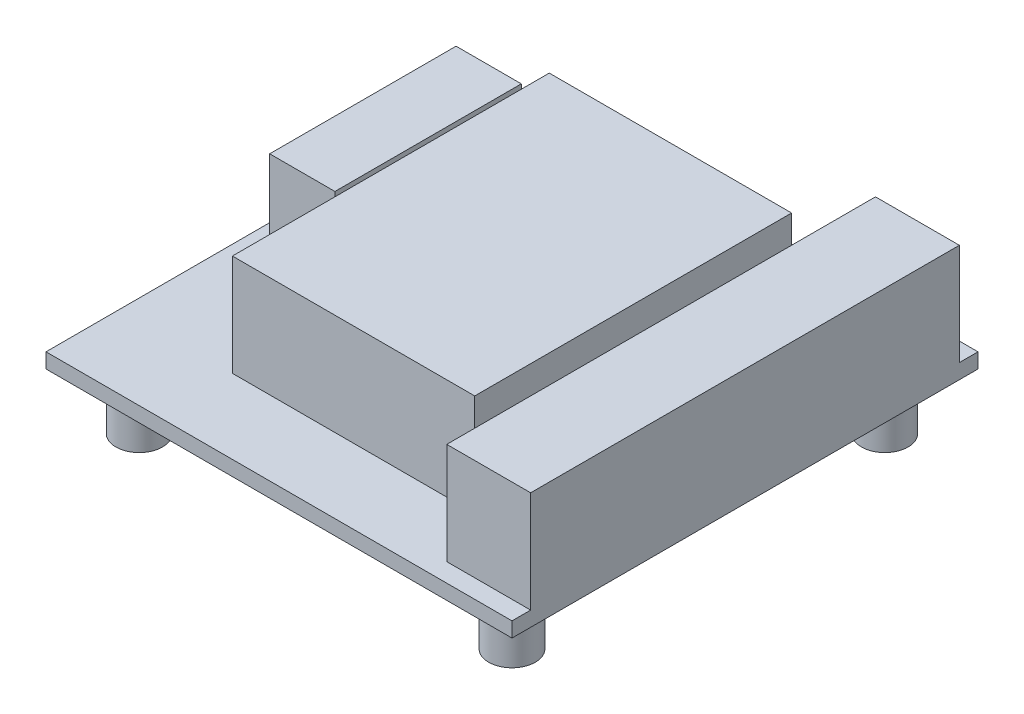
ISO-10303-21;
HEADER;
FILE_DESCRIPTION(('STEP AP214'),'2;1');
FILE_NAME('part.step','',(''),(''),'','','');
FILE_SCHEMA(('AUTOMOTIVE_DESIGN { 1 0 10303 214 1 1 1 1 }'));
ENDSEC;
DATA;
#1=APPLICATION_CONTEXT('core data for automotive mechanical design processes');
#2=APPLICATION_PROTOCOL_DEFINITION('international standard','automotive_design',2000,#1);
#3=PRODUCT_CONTEXT('',#1,'mechanical');
#4=PRODUCT('Part','Part','',(#3));
#5=PRODUCT_RELATED_PRODUCT_CATEGORY('part','',(#4));
#6=PRODUCT_DEFINITION_FORMATION('','',#4);
#7=PRODUCT_DEFINITION_CONTEXT('part definition',#1,'design');
#8=PRODUCT_DEFINITION('design','',#6,#7);
#9=PRODUCT_DEFINITION_SHAPE('','',#8);
#10=(LENGTH_UNIT() NAMED_UNIT(*) SI_UNIT(.MILLI.,.METRE.));
#11=(NAMED_UNIT(*) PLANE_ANGLE_UNIT() SI_UNIT($,.RADIAN.));
#12=(NAMED_UNIT(*) SI_UNIT($,.STERADIAN.) SOLID_ANGLE_UNIT());
#13=UNCERTAINTY_MEASURE_WITH_UNIT(LENGTH_MEASURE(1.E-05),#10,'distance_accuracy_value','');
#14=(GEOMETRIC_REPRESENTATION_CONTEXT(3) GLOBAL_UNCERTAINTY_ASSIGNED_CONTEXT((#13)) GLOBAL_UNIT_ASSIGNED_CONTEXT((#10,
#11,#12)) REPRESENTATION_CONTEXT('',''));
#15=CARTESIAN_POINT('',(0.,0.,0.));
#16=DIRECTION('',(0.,0.,1.));
#17=DIRECTION('',(1.,0.,0.));
#18=AXIS2_PLACEMENT_3D('',#15,#16,#17);
#19=CARTESIAN_POINT('',(0.,7.6,0.));
#20=DIRECTION('',(0.,1.,0.));
#21=DIRECTION('',(0.,0.,1.));
#22=AXIS2_PLACEMENT_3D('',#19,#20,#21);
#23=PLANE('',#22);
#24=DIRECTION('',(-1.,0.,0.));
#25=VECTOR('',#24,1.);
#26=CARTESIAN_POINT('',(25.,7.6,-23.));
#27=LINE('',#26,#25);
#28=CARTESIAN_POINT('',(25.,7.6,-23.));
#29=VERTEX_POINT('',#28);
#30=CARTESIAN_POINT('',(16.,7.6,-23.));
#31=VERTEX_POINT('',#30);
#32=EDGE_CURVE('E193',#29,#31,#27,.T.);
#33=ORIENTED_EDGE('',*,*,#32,.F.);
#34=DIRECTION('',(0.,0.,-1.));
#35=VECTOR('',#34,1.);
#36=CARTESIAN_POINT('',(25.,7.6,25.));
#37=LINE('',#36,#35);
#38=CARTESIAN_POINT('',(25.,7.6,-25.));
#39=VERTEX_POINT('',#38);
#40=EDGE_CURVE('E259',#29,#39,#37,.T.);
#41=ORIENTED_EDGE('',*,*,#40,.T.);
#42=DIRECTION('',(-1.,0.,0.));
#43=VECTOR('',#42,1.);
#44=CARTESIAN_POINT('',(25.,7.6,-25.));
#45=LINE('',#44,#43);
#46=CARTESIAN_POINT('',(-25.,7.6,-25.));
#47=VERTEX_POINT('',#46);
#48=EDGE_CURVE('E263',#39,#47,#45,.T.);
#49=ORIENTED_EDGE('',*,*,#48,.T.);
#50=DIRECTION('',(0.,0.,1.));
#51=VECTOR('',#50,1.);
#52=CARTESIAN_POINT('',(-25.,7.6,-25.));
#53=LINE('',#52,#51);
#54=CARTESIAN_POINT('',(-25.,7.6,25.));
#55=VERTEX_POINT('',#54);
#56=EDGE_CURVE('E251',#47,#55,#53,.T.);
#57=ORIENTED_EDGE('',*,*,#56,.T.);
#58=DIRECTION('',(1.,0.,0.));
#59=VECTOR('',#58,1.);
#60=CARTESIAN_POINT('',(-25.,7.6,25.));
#61=LINE('',#60,#59);
#62=CARTESIAN_POINT('',(25.,7.6,25.));
#63=VERTEX_POINT('',#62);
#64=EDGE_CURVE('E258',#55,#63,#61,.T.);
#65=ORIENTED_EDGE('',*,*,#64,.T.);
#66=CARTESIAN_POINT('',(25.,7.6,23.));
#67=VERTEX_POINT('',#66);
#68=EDGE_CURVE('E257',#63,#67,#37,.T.);
#69=ORIENTED_EDGE('',*,*,#68,.T.);
#70=DIRECTION('',(1.,0.,0.));
#71=VECTOR('',#70,1.);
#72=CARTESIAN_POINT('',(16.,7.6,23.));
#73=LINE('',#72,#71);
#74=CARTESIAN_POINT('',(16.,7.6,23.));
#75=VERTEX_POINT('',#74);
#76=EDGE_CURVE('E183',#75,#67,#73,.T.);
#77=ORIENTED_EDGE('',*,*,#76,.F.);
#78=DIRECTION('',(0.,0.,1.));
#79=VECTOR('',#78,1.);
#80=CARTESIAN_POINT('',(16.,7.6,-23.));
#81=LINE('',#80,#79);
#82=EDGE_CURVE('E181',#31,#75,#81,.T.);
#83=ORIENTED_EDGE('',*,*,#82,.F.);
#84=EDGE_LOOP('',(#33,#41,#49,#57,#65,#69,#77,#83));
#85=FACE_BOUND('',#84,.T.);
#86=DIRECTION('',(0.,0.,1.));
#87=VECTOR('',#86,1.);
#88=CARTESIAN_POINT('',(-13.,7.6,-17.));
#89=LINE('',#88,#87);
#90=CARTESIAN_POINT('',(-13.,7.6,-17.));
#91=VERTEX_POINT('',#90);
#92=CARTESIAN_POINT('',(-13.,7.6,17.));
#93=VERTEX_POINT('',#92);
#94=EDGE_CURVE('E209',#91,#93,#89,.T.);
#95=ORIENTED_EDGE('',*,*,#94,.F.);
#96=DIRECTION('',(-1.,0.,0.));
#97=VECTOR('',#96,1.);
#98=CARTESIAN_POINT('',(13.,7.6,-17.));
#99=LINE('',#98,#97);
#100=CARTESIAN_POINT('',(13.,7.6,-17.));
#101=VERTEX_POINT('',#100);
#102=EDGE_CURVE('E214',#101,#91,#99,.T.);
#103=ORIENTED_EDGE('',*,*,#102,.F.);
#104=DIRECTION('',(0.,0.,-1.));
#105=VECTOR('',#104,1.);
#106=CARTESIAN_POINT('',(13.,7.6,17.));
#107=LINE('',#106,#105);
#108=CARTESIAN_POINT('',(13.,7.6,17.));
#109=VERTEX_POINT('',#108);
#110=EDGE_CURVE('E229',#109,#101,#107,.T.);
#111=ORIENTED_EDGE('',*,*,#110,.F.);
#112=DIRECTION('',(1.,0.,0.));
#113=VECTOR('',#112,1.);
#114=CARTESIAN_POINT('',(-13.,7.6,17.));
#115=LINE('',#114,#113);
#116=EDGE_CURVE('E221',#93,#109,#115,.T.);
#117=ORIENTED_EDGE('',*,*,#116,.F.);
#118=EDGE_LOOP('',(#95,#103,#111,#117));
#119=FACE_BOUND('',#118,.T.);
#120=DIRECTION('',(1.,0.,0.));
#121=VECTOR('',#120,1.);
#122=CARTESIAN_POINT('',(-23.,7.6,3.));
#123=LINE('',#122,#121);
#124=CARTESIAN_POINT('',(-23.,7.6,3.));
#125=VERTEX_POINT('',#124);
#126=CARTESIAN_POINT('',(-16.,7.6,3.));
#127=VERTEX_POINT('',#126);
#128=EDGE_CURVE('E712',#125,#127,#123,.T.);
#129=ORIENTED_EDGE('',*,*,#128,.F.);
#130=DIRECTION('',(0.,0.,1.));
#131=VECTOR('',#130,1.);
#132=CARTESIAN_POINT('',(-23.,7.6,-17.));
#133=LINE('',#132,#131);
#134=CARTESIAN_POINT('',(-23.,7.6,-17.));
#135=VERTEX_POINT('',#134);
#136=EDGE_CURVE('E182',#135,#125,#133,.T.);
#137=ORIENTED_EDGE('',*,*,#136,.F.);
#138=DIRECTION('',(-1.,0.,0.));
#139=VECTOR('',#138,1.);
#140=CARTESIAN_POINT('',(-16.,7.6,-17.));
#141=LINE('',#140,#139);
#142=CARTESIAN_POINT('',(-16.,7.6,-17.));
#143=VERTEX_POINT('',#142);
#144=EDGE_CURVE('E180',#143,#135,#141,.T.);
#145=ORIENTED_EDGE('',*,*,#144,.F.);
#146=DIRECTION('',(0.,0.,-1.));
#147=VECTOR('',#146,1.);
#148=CARTESIAN_POINT('',(-16.,7.6,3.));
#149=LINE('',#148,#147);
#150=EDGE_CURVE('E709',#127,#143,#149,.T.);
#151=ORIENTED_EDGE('',*,*,#150,.F.);
#152=EDGE_LOOP('',(#129,#137,#145,#151));
#153=FACE_BOUND('',#152,.T.);
#154=ADVANCED_FACE('F43',(#85,#119,#153),#23,.T.);
#155=CARTESIAN_POINT('',(-20.,6.,-20.));
#156=DIRECTION('',(0.,-1.,0.));
#157=DIRECTION('',(0.,0.,-1.));
#158=AXIS2_PLACEMENT_3D('',#155,#156,#157);
#159=CYLINDRICAL_SURFACE('',#158,2.5);
#160=CARTESIAN_POINT('',(-20.,6.,-20.));
#161=DIRECTION('',(0.,1.,0.));
#162=DIRECTION('',(0.,0.,1.));
#163=AXIS2_PLACEMENT_3D('',#160,#161,#162);
#164=CIRCLE('',#163,2.5);
#165=CARTESIAN_POINT('',(-20.,6.,-17.5));
#166=VERTEX_POINT('',#165);
#167=EDGE_CURVE('E281',#166,#166,#164,.T.);
#168=ORIENTED_EDGE('',*,*,#167,.F.);
#169=EDGE_LOOP('',(#168));
#170=FACE_BOUND('',#169,.T.);
#171=CARTESIAN_POINT('',(-20.,0.,-20.));
#172=DIRECTION('',(0.,1.,0.));
#173=DIRECTION('',(0.,0.,1.));
#174=AXIS2_PLACEMENT_3D('',#171,#172,#173);
#175=CIRCLE('',#174,2.5);
#176=CARTESIAN_POINT('',(-20.,0.,-17.5));
#177=VERTEX_POINT('',#176);
#178=EDGE_CURVE('E285',#177,#177,#175,.T.);
#179=ORIENTED_EDGE('',*,*,#178,.T.);
#180=EDGE_LOOP('',(#179));
#181=FACE_BOUND('',#180,.T.);
#182=ADVANCED_FACE('F44',(#170,#181),#159,.T.);
#183=CARTESIAN_POINT('',(-20.,0.,-20.));
#184=DIRECTION('',(0.,1.,0.));
#185=DIRECTION('',(0.,0.,1.));
#186=AXIS2_PLACEMENT_3D('',#183,#184,#185);
#187=PLANE('',#186);
#188=ORIENTED_EDGE('',*,*,#178,.F.);
#189=EDGE_LOOP('',(#188));
#190=FACE_BOUND('',#189,.T.);
#191=ADVANCED_FACE('F359',(#190),#187,.F.);
#192=CARTESIAN_POINT('',(-25.,7.6,-25.));
#193=DIRECTION('',(1.,0.,0.));
#194=DIRECTION('',(0.,0.,-1.));
#195=AXIS2_PLACEMENT_3D('',#192,#193,#194);
#196=PLANE('',#195);
#197=DIRECTION('',(0.,0.,1.));
#198=VECTOR('',#197,1.);
#199=CARTESIAN_POINT('',(-25.,6.,-25.));
#200=LINE('',#199,#198);
#201=CARTESIAN_POINT('',(-25.,6.,-25.));
#202=VERTEX_POINT('',#201);
#203=CARTESIAN_POINT('',(-25.,6.,25.));
#204=VERTEX_POINT('',#203);
#205=EDGE_CURVE('E252',#202,#204,#200,.T.);
#206=ORIENTED_EDGE('',*,*,#205,.T.);
#207=DIRECTION('',(0.,-1.,0.));
#208=VECTOR('',#207,1.);
#209=CARTESIAN_POINT('',(-25.,7.6,25.));
#210=LINE('',#209,#208);
#211=EDGE_CURVE('E283',#55,#204,#210,.T.);
#212=ORIENTED_EDGE('',*,*,#211,.F.);
#213=ORIENTED_EDGE('',*,*,#56,.F.);
#214=DIRECTION('',(0.,-1.,0.));
#215=VECTOR('',#214,1.);
#216=CARTESIAN_POINT('',(-25.,7.6,-25.));
#217=LINE('',#216,#215);
#218=EDGE_CURVE('E264',#47,#202,#217,.T.);
#219=ORIENTED_EDGE('',*,*,#218,.T.);
#220=EDGE_LOOP('',(#206,#212,#213,#219));
#221=FACE_BOUND('',#220,.T.);
#222=ADVANCED_FACE('F314',(#221),#196,.F.);
#223=CARTESIAN_POINT('',(-25.,7.6,25.));
#224=DIRECTION('',(0.,0.,-1.));
#225=DIRECTION('',(-1.,0.,0.));
#226=AXIS2_PLACEMENT_3D('',#223,#224,#225);
#227=PLANE('',#226);
#228=DIRECTION('',(1.,0.,0.));
#229=VECTOR('',#228,1.);
#230=CARTESIAN_POINT('',(-25.,6.,25.));
#231=LINE('',#230,#229);
#232=CARTESIAN_POINT('',(25.,6.,25.));
#233=VERTEX_POINT('',#232);
#234=EDGE_CURVE('E268',#204,#233,#231,.T.);
#235=ORIENTED_EDGE('',*,*,#234,.T.);
#236=DIRECTION('',(0.,-1.,0.));
#237=VECTOR('',#236,1.);
#238=CARTESIAN_POINT('',(25.,7.6,25.));
#239=LINE('',#238,#237);
#240=EDGE_CURVE('E279',#63,#233,#239,.T.);
#241=ORIENTED_EDGE('',*,*,#240,.F.);
#242=ORIENTED_EDGE('',*,*,#64,.F.);
#243=ORIENTED_EDGE('',*,*,#211,.T.);
#244=EDGE_LOOP('',(#235,#241,#242,#243));
#245=FACE_BOUND('',#244,.T.);
#246=ADVANCED_FACE('F330',(#245),#227,.F.);
#247=CARTESIAN_POINT('',(25.,7.6,25.));
#248=DIRECTION('',(-1.,0.,0.));
#249=DIRECTION('',(0.,0.,1.));
#250=AXIS2_PLACEMENT_3D('',#247,#248,#249);
#251=PLANE('',#250);
#252=DIRECTION('',(0.,0.,-1.));
#253=VECTOR('',#252,1.);
#254=CARTESIAN_POINT('',(25.,6.,25.));
#255=LINE('',#254,#253);
#256=CARTESIAN_POINT('',(25.,6.,-25.));
#257=VERTEX_POINT('',#256);
#258=EDGE_CURVE('E269',#233,#257,#255,.T.);
#259=ORIENTED_EDGE('',*,*,#258,.T.);
#260=DIRECTION('',(0.,-1.,0.));
#261=VECTOR('',#260,1.);
#262=CARTESIAN_POINT('',(25.,7.6,-25.));
#263=LINE('',#262,#261);
#264=EDGE_CURVE('E274',#39,#257,#263,.T.);
#265=ORIENTED_EDGE('',*,*,#264,.F.);
#266=ORIENTED_EDGE('',*,*,#40,.F.);
#267=DIRECTION('',(0.,-1.,0.));
#268=VECTOR('',#267,1.);
#269=CARTESIAN_POINT('',(25.,18.5,-23.));
#270=LINE('',#269,#268);
#271=CARTESIAN_POINT('',(25.,18.5,-23.));
#272=VERTEX_POINT('',#271);
#273=EDGE_CURVE('E201',#272,#29,#270,.T.);
#274=ORIENTED_EDGE('',*,*,#273,.F.);
#275=DIRECTION('',(0.,0.,-1.));
#276=VECTOR('',#275,1.);
#277=CARTESIAN_POINT('',(25.,18.5,23.));
#278=LINE('',#277,#276);
#279=CARTESIAN_POINT('',(25.,18.5,23.));
#280=VERTEX_POINT('',#279);
#281=EDGE_CURVE('E198',#280,#272,#278,.T.);
#282=ORIENTED_EDGE('',*,*,#281,.F.);
#283=DIRECTION('',(0.,-1.,0.));
#284=VECTOR('',#283,1.);
#285=CARTESIAN_POINT('',(25.,18.5,23.));
#286=LINE('',#285,#284);
#287=EDGE_CURVE('E202',#280,#67,#286,.T.);
#288=ORIENTED_EDGE('',*,*,#287,.T.);
#289=ORIENTED_EDGE('',*,*,#68,.F.);
#290=ORIENTED_EDGE('',*,*,#240,.T.);
#291=EDGE_LOOP('',(#259,#265,#266,#274,#282,#288,#289,#290));
#292=FACE_BOUND('',#291,.T.);
#293=ADVANCED_FACE('F325',(#292),#251,.F.);
#294=CARTESIAN_POINT('',(25.,7.6,-25.));
#295=DIRECTION('',(0.,0.,1.));
#296=DIRECTION('',(1.,0.,0.));
#297=AXIS2_PLACEMENT_3D('',#294,#295,#296);
#298=PLANE('',#297);
#299=DIRECTION('',(-1.,0.,0.));
#300=VECTOR('',#299,1.);
#301=CARTESIAN_POINT('',(25.,6.,-25.));
#302=LINE('',#301,#300);
#303=EDGE_CURVE('E260',#257,#202,#302,.T.);
#304=ORIENTED_EDGE('',*,*,#303,.T.);
#305=ORIENTED_EDGE('',*,*,#218,.F.);
#306=ORIENTED_EDGE('',*,*,#48,.F.);
#307=ORIENTED_EDGE('',*,*,#264,.T.);
#308=EDGE_LOOP('',(#304,#305,#306,#307));
#309=FACE_BOUND('',#308,.T.);
#310=ADVANCED_FACE('F305',(#309),#298,.F.);
#311=CARTESIAN_POINT('',(0.,6.,0.));
#312=DIRECTION('',(0.,1.,0.));
#313=DIRECTION('',(0.,0.,1.));
#314=AXIS2_PLACEMENT_3D('',#311,#312,#313);
#315=PLANE('',#314);
#316=CARTESIAN_POINT('',(20.,6.,20.));
#317=DIRECTION('',(0.,1.,0.));
#318=DIRECTION('',(0.,0.,1.));
#319=AXIS2_PLACEMENT_3D('',#316,#317,#318);
#320=CIRCLE('',#319,2.5);
#321=CARTESIAN_POINT('',(20.,6.,22.5));
#322=VERTEX_POINT('',#321);
#323=EDGE_CURVE('E11',#322,#322,#320,.F.);
#324=ORIENTED_EDGE('',*,*,#323,.F.);
#325=EDGE_LOOP('',(#324));
#326=FACE_BOUND('',#325,.T.);
#327=CARTESIAN_POINT('',(-20.,6.,20.));
#328=DIRECTION('',(0.,1.,0.));
#329=DIRECTION('',(0.,0.,1.));
#330=AXIS2_PLACEMENT_3D('',#327,#328,#329);
#331=CIRCLE('',#330,2.5);
#332=CARTESIAN_POINT('',(-20.,6.,22.5));
#333=VERTEX_POINT('',#332);
#334=EDGE_CURVE('E51',#333,#333,#331,.F.);
#335=ORIENTED_EDGE('',*,*,#334,.F.);
#336=EDGE_LOOP('',(#335));
#337=FACE_BOUND('',#336,.T.);
#338=CARTESIAN_POINT('',(20.,6.,-20.));
#339=DIRECTION('',(0.,1.,0.));
#340=DIRECTION('',(0.,0.,1.));
#341=AXIS2_PLACEMENT_3D('',#338,#339,#340);
#342=CIRCLE('',#341,2.5);
#343=CARTESIAN_POINT('',(20.,6.,-17.5));
#344=VERTEX_POINT('',#343);
#345=EDGE_CURVE('E287',#344,#344,#342,.F.);
#346=ORIENTED_EDGE('',*,*,#345,.F.);
#347=EDGE_LOOP('',(#346));
#348=FACE_BOUND('',#347,.T.);
#349=ORIENTED_EDGE('',*,*,#167,.T.);
#350=EDGE_LOOP('',(#349));
#351=FACE_BOUND('',#350,.T.);
#352=ORIENTED_EDGE('',*,*,#205,.F.);
#353=ORIENTED_EDGE('',*,*,#303,.F.);
#354=ORIENTED_EDGE('',*,*,#258,.F.);
#355=ORIENTED_EDGE('',*,*,#234,.F.);
#356=EDGE_LOOP('',(#352,#353,#354,#355));
#357=FACE_BOUND('',#356,.T.);
#358=ADVANCED_FACE('F297',(#326,#337,#348,#351,#357),#315,.F.);
#359=CARTESIAN_POINT('',(20.,6.,-20.));
#360=DIRECTION('',(0.,-1.,0.));
#361=DIRECTION('',(0.,0.,-1.));
#362=AXIS2_PLACEMENT_3D('',#359,#360,#361);
#363=CYLINDRICAL_SURFACE('',#362,2.5);
#364=ORIENTED_EDGE('',*,*,#345,.T.);
#365=EDGE_LOOP('',(#364));
#366=FACE_BOUND('',#365,.T.);
#367=CARTESIAN_POINT('',(20.,0.,-20.));
#368=DIRECTION('',(0.,1.,0.));
#369=DIRECTION('',(0.,0.,1.));
#370=AXIS2_PLACEMENT_3D('',#367,#368,#369);
#371=CIRCLE('',#370,2.5);
#372=CARTESIAN_POINT('',(20.,0.,-17.5));
#373=VERTEX_POINT('',#372);
#374=EDGE_CURVE('E248',#373,#373,#371,.T.);
#375=ORIENTED_EDGE('',*,*,#374,.T.);
#376=EDGE_LOOP('',(#375));
#377=FACE_BOUND('',#376,.T.);
#378=ADVANCED_FACE('F301',(#366,#377),#363,.T.);
#379=CARTESIAN_POINT('',(20.,0.,-20.));
#380=DIRECTION('',(0.,1.,0.));
#381=DIRECTION('',(0.,0.,1.));
#382=AXIS2_PLACEMENT_3D('',#379,#380,#381);
#383=PLANE('',#382);
#384=ORIENTED_EDGE('',*,*,#374,.F.);
#385=EDGE_LOOP('',(#384));
#386=FACE_BOUND('',#385,.T.);
#387=ADVANCED_FACE('F408',(#386),#383,.F.);
#388=CARTESIAN_POINT('',(-20.,6.,20.));
#389=DIRECTION('',(0.,-1.,0.));
#390=DIRECTION('',(0.,0.,-1.));
#391=AXIS2_PLACEMENT_3D('',#388,#389,#390);
#392=CYLINDRICAL_SURFACE('',#391,2.5);
#393=ORIENTED_EDGE('',*,*,#334,.T.);
#394=EDGE_LOOP('',(#393));
#395=FACE_BOUND('',#394,.T.);
#396=CARTESIAN_POINT('',(-20.,0.,20.));
#397=DIRECTION('',(0.,1.,0.));
#398=DIRECTION('',(0.,0.,1.));
#399=AXIS2_PLACEMENT_3D('',#396,#397,#398);
#400=CIRCLE('',#399,2.5);
#401=CARTESIAN_POINT('',(-20.,0.,22.5));
#402=VERTEX_POINT('',#401);
#403=EDGE_CURVE('E246',#402,#402,#400,.T.);
#404=ORIENTED_EDGE('',*,*,#403,.T.);
#405=EDGE_LOOP('',(#404));
#406=FACE_BOUND('',#405,.T.);
#407=ADVANCED_FACE('F293',(#395,#406),#392,.T.);
#408=CARTESIAN_POINT('',(-20.,0.,20.));
#409=DIRECTION('',(0.,1.,0.));
#410=DIRECTION('',(0.,0.,1.));
#411=AXIS2_PLACEMENT_3D('',#408,#409,#410);
#412=PLANE('',#411);
#413=ORIENTED_EDGE('',*,*,#403,.F.);
#414=EDGE_LOOP('',(#413));
#415=FACE_BOUND('',#414,.T.);
#416=ADVANCED_FACE('F420',(#415),#412,.F.);
#417=CARTESIAN_POINT('',(20.,6.,20.));
#418=DIRECTION('',(0.,-1.,0.));
#419=DIRECTION('',(0.,0.,-1.));
#420=AXIS2_PLACEMENT_3D('',#417,#418,#419);
#421=CYLINDRICAL_SURFACE('',#420,2.5);
#422=ORIENTED_EDGE('',*,*,#323,.T.);
#423=EDGE_LOOP('',(#422));
#424=FACE_BOUND('',#423,.T.);
#425=CARTESIAN_POINT('',(20.,0.,20.));
#426=DIRECTION('',(0.,1.,0.));
#427=DIRECTION('',(0.,0.,1.));
#428=AXIS2_PLACEMENT_3D('',#425,#426,#427);
#429=CIRCLE('',#428,2.5);
#430=CARTESIAN_POINT('',(20.,0.,22.5));
#431=VERTEX_POINT('',#430);
#432=EDGE_CURVE('E242',#431,#431,#429,.T.);
#433=ORIENTED_EDGE('',*,*,#432,.T.);
#434=EDGE_LOOP('',(#433));
#435=FACE_BOUND('',#434,.T.);
#436=ADVANCED_FACE('F426',(#424,#435),#421,.T.);
#437=CARTESIAN_POINT('',(20.,0.,20.));
#438=DIRECTION('',(0.,1.,0.));
#439=DIRECTION('',(0.,0.,1.));
#440=AXIS2_PLACEMENT_3D('',#437,#438,#439);
#441=PLANE('',#440);
#442=ORIENTED_EDGE('',*,*,#432,.F.);
#443=EDGE_LOOP('',(#442));
#444=FACE_BOUND('',#443,.T.);
#445=ADVANCED_FACE('F432',(#444),#441,.F.);
#446=CARTESIAN_POINT('',(-13.,18.5,-17.));
#447=DIRECTION('',(1.,0.,0.));
#448=DIRECTION('',(0.,0.,-1.));
#449=AXIS2_PLACEMENT_3D('',#446,#447,#448);
#450=PLANE('',#449);
#451=ORIENTED_EDGE('',*,*,#94,.T.);
#452=DIRECTION('',(0.,-1.,0.));
#453=VECTOR('',#452,1.);
#454=CARTESIAN_POINT('',(-13.,18.5,17.));
#455=LINE('',#454,#453);
#456=CARTESIAN_POINT('',(-13.,18.5,17.));
#457=VERTEX_POINT('',#456);
#458=EDGE_CURVE('E238',#457,#93,#455,.T.);
#459=ORIENTED_EDGE('',*,*,#458,.F.);
#460=DIRECTION('',(0.,0.,1.));
#461=VECTOR('',#460,1.);
#462=CARTESIAN_POINT('',(-13.,18.5,-17.));
#463=LINE('',#462,#461);
#464=CARTESIAN_POINT('',(-13.,18.5,-17.));
#465=VERTEX_POINT('',#464);
#466=EDGE_CURVE('E211',#465,#457,#463,.T.);
#467=ORIENTED_EDGE('',*,*,#466,.F.);
#468=DIRECTION('',(0.,-1.,0.));
#469=VECTOR('',#468,1.);
#470=CARTESIAN_POINT('',(-13.,18.5,-17.));
#471=LINE('',#470,#469);
#472=EDGE_CURVE('E222',#465,#91,#471,.T.);
#473=ORIENTED_EDGE('',*,*,#472,.T.);
#474=EDGE_LOOP('',(#451,#459,#467,#473));
#475=FACE_BOUND('',#474,.T.);
#476=ADVANCED_FACE('F445',(#475),#450,.F.);
#477=CARTESIAN_POINT('',(-13.,18.5,17.));
#478=DIRECTION('',(0.,0.,-1.));
#479=DIRECTION('',(-1.,0.,0.));
#480=AXIS2_PLACEMENT_3D('',#477,#478,#479);
#481=PLANE('',#480);
#482=ORIENTED_EDGE('',*,*,#116,.T.);
#483=DIRECTION('',(0.,-1.,0.));
#484=VECTOR('',#483,1.);
#485=CARTESIAN_POINT('',(13.,18.5,17.));
#486=LINE('',#485,#484);
#487=CARTESIAN_POINT('',(13.,18.5,17.));
#488=VERTEX_POINT('',#487);
#489=EDGE_CURVE('E240',#488,#109,#486,.T.);
#490=ORIENTED_EDGE('',*,*,#489,.F.);
#491=DIRECTION('',(1.,0.,0.));
#492=VECTOR('',#491,1.);
#493=CARTESIAN_POINT('',(-13.,18.5,17.));
#494=LINE('',#493,#492);
#495=EDGE_CURVE('E212',#457,#488,#494,.T.);
#496=ORIENTED_EDGE('',*,*,#495,.F.);
#497=ORIENTED_EDGE('',*,*,#458,.T.);
#498=EDGE_LOOP('',(#482,#490,#496,#497));
#499=FACE_BOUND('',#498,.T.);
#500=ADVANCED_FACE('F446',(#499),#481,.F.);
#501=CARTESIAN_POINT('',(13.,18.5,17.));
#502=DIRECTION('',(-1.,0.,0.));
#503=DIRECTION('',(0.,0.,1.));
#504=AXIS2_PLACEMENT_3D('',#501,#502,#503);
#505=PLANE('',#504);
#506=ORIENTED_EDGE('',*,*,#110,.T.);
#507=DIRECTION('',(0.,-1.,0.));
#508=VECTOR('',#507,1.);
#509=CARTESIAN_POINT('',(13.,18.5,-17.));
#510=LINE('',#509,#508);
#511=CARTESIAN_POINT('',(13.,18.5,-17.));
#512=VERTEX_POINT('',#511);
#513=EDGE_CURVE('E233',#512,#101,#510,.T.);
#514=ORIENTED_EDGE('',*,*,#513,.F.);
#515=DIRECTION('',(0.,0.,-1.));
#516=VECTOR('',#515,1.);
#517=CARTESIAN_POINT('',(13.,18.5,17.));
#518=LINE('',#517,#516);
#519=EDGE_CURVE('E220',#488,#512,#518,.T.);
#520=ORIENTED_EDGE('',*,*,#519,.F.);
#521=ORIENTED_EDGE('',*,*,#489,.T.);
#522=EDGE_LOOP('',(#506,#514,#520,#521));
#523=FACE_BOUND('',#522,.T.);
#524=ADVANCED_FACE('F456',(#523),#505,.F.);
#525=CARTESIAN_POINT('',(13.,18.5,-17.));
#526=DIRECTION('',(0.,0.,1.));
#527=DIRECTION('',(1.,0.,0.));
#528=AXIS2_PLACEMENT_3D('',#525,#526,#527);
#529=PLANE('',#528);
#530=ORIENTED_EDGE('',*,*,#102,.T.);
#531=ORIENTED_EDGE('',*,*,#472,.F.);
#532=DIRECTION('',(-1.,0.,0.));
#533=VECTOR('',#532,1.);
#534=CARTESIAN_POINT('',(13.,18.5,-17.));
#535=LINE('',#534,#533);
#536=EDGE_CURVE('E218',#512,#465,#535,.T.);
#537=ORIENTED_EDGE('',*,*,#536,.F.);
#538=ORIENTED_EDGE('',*,*,#513,.T.);
#539=EDGE_LOOP('',(#530,#531,#537,#538));
#540=FACE_BOUND('',#539,.T.);
#541=ADVANCED_FACE('F354',(#540),#529,.F.);
#542=CARTESIAN_POINT('',(0.,18.5,0.));
#543=DIRECTION('',(0.,1.,0.));
#544=DIRECTION('',(0.,0.,1.));
#545=AXIS2_PLACEMENT_3D('',#542,#543,#544);
#546=PLANE('',#545);
#547=ORIENTED_EDGE('',*,*,#466,.T.);
#548=ORIENTED_EDGE('',*,*,#495,.T.);
#549=ORIENTED_EDGE('',*,*,#519,.T.);
#550=ORIENTED_EDGE('',*,*,#536,.T.);
#551=EDGE_LOOP('',(#547,#548,#549,#550));
#552=FACE_BOUND('',#551,.T.);
#553=ADVANCED_FACE('F344',(#552),#546,.T.);
#554=CARTESIAN_POINT('',(16.,18.5,-23.));
#555=DIRECTION('',(1.,0.,0.));
#556=DIRECTION('',(0.,0.,-1.));
#557=AXIS2_PLACEMENT_3D('',#554,#555,#556);
#558=PLANE('',#557);
#559=ORIENTED_EDGE('',*,*,#82,.T.);
#560=DIRECTION('',(0.,-1.,0.));
#561=VECTOR('',#560,1.);
#562=CARTESIAN_POINT('',(16.,18.5,23.));
#563=LINE('',#562,#561);
#564=CARTESIAN_POINT('',(16.,18.5,23.));
#565=VERTEX_POINT('',#564);
#566=EDGE_CURVE('E208',#565,#75,#563,.T.);
#567=ORIENTED_EDGE('',*,*,#566,.F.);
#568=DIRECTION('',(0.,0.,1.));
#569=VECTOR('',#568,1.);
#570=CARTESIAN_POINT('',(16.,18.5,-23.));
#571=LINE('',#570,#569);
#572=CARTESIAN_POINT('',(16.,18.5,-23.));
#573=VERTEX_POINT('',#572);
#574=EDGE_CURVE('E186',#573,#565,#571,.T.);
#575=ORIENTED_EDGE('',*,*,#574,.F.);
#576=DIRECTION('',(0.,-1.,0.));
#577=VECTOR('',#576,1.);
#578=CARTESIAN_POINT('',(16.,18.5,-23.));
#579=LINE('',#578,#577);
#580=EDGE_CURVE('E66',#573,#31,#579,.T.);
#581=ORIENTED_EDGE('',*,*,#580,.T.);
#582=EDGE_LOOP('',(#559,#567,#575,#581));
#583=FACE_BOUND('',#582,.T.);
#584=ADVANCED_FACE('F342',(#583),#558,.F.);
#585=CARTESIAN_POINT('',(16.,18.5,23.));
#586=DIRECTION('',(0.,0.,-1.));
#587=DIRECTION('',(-1.,0.,0.));
#588=AXIS2_PLACEMENT_3D('',#585,#586,#587);
#589=PLANE('',#588);
#590=ORIENTED_EDGE('',*,*,#76,.T.);
#591=ORIENTED_EDGE('',*,*,#287,.F.);
#592=DIRECTION('',(1.,0.,0.));
#593=VECTOR('',#592,1.);
#594=CARTESIAN_POINT('',(16.,18.5,23.));
#595=LINE('',#594,#593);
#596=EDGE_CURVE('E192',#565,#280,#595,.T.);
#597=ORIENTED_EDGE('',*,*,#596,.F.);
#598=ORIENTED_EDGE('',*,*,#566,.T.);
#599=EDGE_LOOP('',(#590,#591,#597,#598));
#600=FACE_BOUND('',#599,.T.);
#601=ADVANCED_FACE('F345',(#600),#589,.F.);
#602=CARTESIAN_POINT('',(25.,18.5,-23.));
#603=DIRECTION('',(0.,0.,1.));
#604=DIRECTION('',(1.,0.,0.));
#605=AXIS2_PLACEMENT_3D('',#602,#603,#604);
#606=PLANE('',#605);
#607=ORIENTED_EDGE('',*,*,#32,.T.);
#608=ORIENTED_EDGE('',*,*,#580,.F.);
#609=DIRECTION('',(-1.,0.,0.));
#610=VECTOR('',#609,1.);
#611=CARTESIAN_POINT('',(25.,18.5,-23.));
#612=LINE('',#611,#610);
#613=EDGE_CURVE('E196',#272,#573,#612,.T.);
#614=ORIENTED_EDGE('',*,*,#613,.F.);
#615=ORIENTED_EDGE('',*,*,#273,.T.);
#616=EDGE_LOOP('',(#607,#608,#614,#615));
#617=FACE_BOUND('',#616,.T.);
#618=ADVANCED_FACE('F331',(#617),#606,.F.);
#619=CARTESIAN_POINT('',(0.,18.5,0.));
#620=DIRECTION('',(0.,1.,0.));
#621=DIRECTION('',(0.,0.,1.));
#622=AXIS2_PLACEMENT_3D('',#619,#620,#621);
#623=PLANE('',#622);
#624=ORIENTED_EDGE('',*,*,#574,.T.);
#625=ORIENTED_EDGE('',*,*,#596,.T.);
#626=ORIENTED_EDGE('',*,*,#281,.T.);
#627=ORIENTED_EDGE('',*,*,#613,.T.);
#628=EDGE_LOOP('',(#624,#625,#626,#627));
#629=FACE_BOUND('',#628,.T.);
#630=ADVANCED_FACE('F340',(#629),#623,.T.);
#631=CARTESIAN_POINT('',(-23.,16.,-17.));
#632=DIRECTION('',(1.,0.,0.));
#633=DIRECTION('',(0.,0.,-1.));
#634=AXIS2_PLACEMENT_3D('',#631,#632,#633);
#635=PLANE('',#634);
#636=ORIENTED_EDGE('',*,*,#136,.T.);
#637=DIRECTION('',(0.,-1.,0.));
#638=VECTOR('',#637,1.);
#639=CARTESIAN_POINT('',(-23.,16.,3.));
#640=LINE('',#639,#638);
#641=CARTESIAN_POINT('',(-23.,16.,3.));
#642=VERTEX_POINT('',#641);
#643=EDGE_CURVE('E165',#642,#125,#640,.T.);
#644=ORIENTED_EDGE('',*,*,#643,.F.);
#645=DIRECTION('',(0.,0.,1.));
#646=VECTOR('',#645,1.);
#647=CARTESIAN_POINT('',(-23.,16.,-17.));
#648=LINE('',#647,#646);
#649=CARTESIAN_POINT('',(-23.,16.,-17.));
#650=VERTEX_POINT('',#649);
#651=EDGE_CURVE('E166',#650,#642,#648,.T.);
#652=ORIENTED_EDGE('',*,*,#651,.F.);
#653=DIRECTION('',(0.,-1.,0.));
#654=VECTOR('',#653,1.);
#655=CARTESIAN_POINT('',(-23.,16.,-17.));
#656=LINE('',#655,#654);
#657=EDGE_CURVE('E710',#650,#135,#656,.T.);
#658=ORIENTED_EDGE('',*,*,#657,.T.);
#659=EDGE_LOOP('',(#636,#644,#652,#658));
#660=FACE_BOUND('',#659,.T.);
#661=ADVANCED_FACE('F178',(#660),#635,.F.);
#662=CARTESIAN_POINT('',(-23.,16.,3.));
#663=DIRECTION('',(0.,0.,-1.));
#664=DIRECTION('',(-1.,0.,0.));
#665=AXIS2_PLACEMENT_3D('',#662,#663,#664);
#666=PLANE('',#665);
#667=ORIENTED_EDGE('',*,*,#128,.T.);
#668=DIRECTION('',(0.,-1.,0.));
#669=VECTOR('',#668,1.);
#670=CARTESIAN_POINT('',(-16.,16.,3.));
#671=LINE('',#670,#669);
#672=CARTESIAN_POINT('',(-16.,16.,3.));
#673=VERTEX_POINT('',#672);
#674=EDGE_CURVE('E164',#673,#127,#671,.T.);
#675=ORIENTED_EDGE('',*,*,#674,.F.);
#676=DIRECTION('',(1.,0.,0.));
#677=VECTOR('',#676,1.);
#678=CARTESIAN_POINT('',(-23.,16.,3.));
#679=LINE('',#678,#677);
#680=EDGE_CURVE('E158',#642,#673,#679,.T.);
#681=ORIENTED_EDGE('',*,*,#680,.F.);
#682=ORIENTED_EDGE('',*,*,#643,.T.);
#683=EDGE_LOOP('',(#667,#675,#681,#682));
#684=FACE_BOUND('',#683,.T.);
#685=ADVANCED_FACE('F159',(#684),#666,.F.);
#686=CARTESIAN_POINT('',(-16.,16.,3.));
#687=DIRECTION('',(-1.,0.,0.));
#688=DIRECTION('',(0.,0.,1.));
#689=AXIS2_PLACEMENT_3D('',#686,#687,#688);
#690=PLANE('',#689);
#691=ORIENTED_EDGE('',*,*,#150,.T.);
#692=DIRECTION('',(0.,-1.,0.));
#693=VECTOR('',#692,1.);
#694=CARTESIAN_POINT('',(-16.,16.,-17.));
#695=LINE('',#694,#693);
#696=CARTESIAN_POINT('',(-16.,16.,-17.));
#697=VERTEX_POINT('',#696);
#698=EDGE_CURVE('E59',#697,#143,#695,.T.);
#699=ORIENTED_EDGE('',*,*,#698,.F.);
#700=DIRECTION('',(0.,0.,-1.));
#701=VECTOR('',#700,1.);
#702=CARTESIAN_POINT('',(-16.,16.,3.));
#703=LINE('',#702,#701);
#704=EDGE_CURVE('E169',#673,#697,#703,.T.);
#705=ORIENTED_EDGE('',*,*,#704,.F.);
#706=ORIENTED_EDGE('',*,*,#674,.T.);
#707=EDGE_LOOP('',(#691,#699,#705,#706));
#708=FACE_BOUND('',#707,.T.);
#709=ADVANCED_FACE('F525',(#708),#690,.F.);
#710=CARTESIAN_POINT('',(-16.,16.,-17.));
#711=DIRECTION('',(0.,0.,1.));
#712=DIRECTION('',(1.,0.,0.));
#713=AXIS2_PLACEMENT_3D('',#710,#711,#712);
#714=PLANE('',#713);
#715=ORIENTED_EDGE('',*,*,#144,.T.);
#716=ORIENTED_EDGE('',*,*,#657,.F.);
#717=DIRECTION('',(-1.,0.,0.));
#718=VECTOR('',#717,1.);
#719=CARTESIAN_POINT('',(-16.,16.,-17.));
#720=LINE('',#719,#718);
#721=EDGE_CURVE('E172',#697,#650,#720,.T.);
#722=ORIENTED_EDGE('',*,*,#721,.F.);
#723=ORIENTED_EDGE('',*,*,#698,.T.);
#724=EDGE_LOOP('',(#715,#716,#722,#723));
#725=FACE_BOUND('',#724,.T.);
#726=ADVANCED_FACE('F533',(#725),#714,.F.);
#727=CARTESIAN_POINT('',(0.,16.,0.));
#728=DIRECTION('',(0.,1.,0.));
#729=DIRECTION('',(0.,0.,1.));
#730=AXIS2_PLACEMENT_3D('',#727,#728,#729);
#731=PLANE('',#730);
#732=ORIENTED_EDGE('',*,*,#651,.T.);
#733=ORIENTED_EDGE('',*,*,#680,.T.);
#734=ORIENTED_EDGE('',*,*,#704,.T.);
#735=ORIENTED_EDGE('',*,*,#721,.T.);
#736=EDGE_LOOP('',(#732,#733,#734,#735));
#737=FACE_BOUND('',#736,.T.);
#738=ADVANCED_FACE('F174',(#737),#731,.T.);
#739=CLOSED_SHELL('',(#154,#182,#191,#222,#246,#293,#310,#358,#378,#387,#407,#416,#436,#445,
#476,#500,#524,#541,#553,#584,#601,#618,#630,#661,#685,#709,#726,#738));
#740=MANIFOLD_SOLID_BREP('B2',#739);
#741=ADVANCED_BREP_SHAPE_REPRESENTATION('',(#18,#740),#14);
#742=SHAPE_DEFINITION_REPRESENTATION(#9,#741);
ENDSEC;
END-ISO-10303-21;
